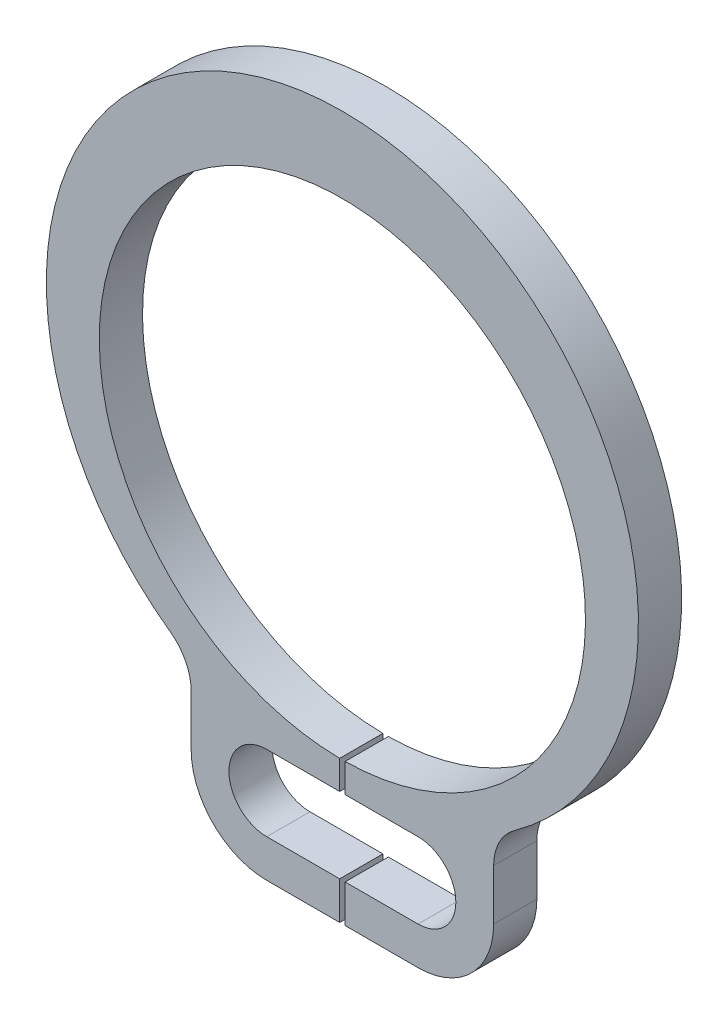
ISO-10303-21;
HEADER;
FILE_DESCRIPTION(('STEP AP214'),'2;1');
FILE_NAME('part.step','',(''),(''),'','','');
FILE_SCHEMA(('AUTOMOTIVE_DESIGN { 1 0 10303 214 1 1 1 1 }'));
ENDSEC;
DATA;
#1=APPLICATION_CONTEXT('core data for automotive mechanical design processes');
#2=APPLICATION_PROTOCOL_DEFINITION('international standard','automotive_design',2000,#1);
#3=PRODUCT_CONTEXT('',#1,'mechanical');
#4=PRODUCT('Part','Part','',(#3));
#5=PRODUCT_RELATED_PRODUCT_CATEGORY('part','',(#4));
#6=PRODUCT_DEFINITION_FORMATION('','',#4);
#7=PRODUCT_DEFINITION_CONTEXT('part definition',#1,'design');
#8=PRODUCT_DEFINITION('design','',#6,#7);
#9=PRODUCT_DEFINITION_SHAPE('','',#8);
#10=(LENGTH_UNIT() NAMED_UNIT(*) SI_UNIT(.MILLI.,.METRE.));
#11=(NAMED_UNIT(*) PLANE_ANGLE_UNIT() SI_UNIT($,.RADIAN.));
#12=(NAMED_UNIT(*) SI_UNIT($,.STERADIAN.) SOLID_ANGLE_UNIT());
#13=UNCERTAINTY_MEASURE_WITH_UNIT(LENGTH_MEASURE(1.E-05),#10,'distance_accuracy_value','');
#14=(GEOMETRIC_REPRESENTATION_CONTEXT(3) GLOBAL_UNCERTAINTY_ASSIGNED_CONTEXT((#13)) GLOBAL_UNIT_ASSIGNED_CONTEXT((#10,
#11,#12)) REPRESENTATION_CONTEXT('',''));
#15=CARTESIAN_POINT('',(0.,0.,0.));
#16=DIRECTION('',(0.,0.,1.));
#17=DIRECTION('',(1.,0.,0.));
#18=AXIS2_PLACEMENT_3D('',#15,#16,#17);
#19=CARTESIAN_POINT('',(0.7,-2.86574597618142,0.4));
#20=DIRECTION('',(0.,0.,-1.));
#21=DIRECTION('',(-1.,0.,0.));
#22=AXIS2_PLACEMENT_3D('',#19,#20,#21);
#23=CYLINDRICAL_SURFACE('',#22,0.35);
#24=CARTESIAN_POINT('',(0.7,-2.86574597618142,0.4));
#25=DIRECTION('',(0.,0.,1.));
#26=DIRECTION('',(-1.,0.,0.));
#27=AXIS2_PLACEMENT_3D('',#24,#25,#26);
#28=CIRCLE('',#27,0.35);
#29=CARTESIAN_POINT('',(0.7,-3.21574597618142,0.4));
#30=VERTEX_POINT('',#29);
#31=CARTESIAN_POINT('',(0.7,-2.51574597618142,0.4));
#32=VERTEX_POINT('',#31);
#33=EDGE_CURVE('E195',#30,#32,#28,.T.);
#34=ORIENTED_EDGE('',*,*,#33,.T.);
#35=DIRECTION('',(0.,0.,1.));
#36=VECTOR('',#35,1.);
#37=CARTESIAN_POINT('',(0.7,-2.51574597618142,0.));
#38=LINE('',#37,#36);
#39=CARTESIAN_POINT('',(0.7,-2.51574597618142,0.));
#40=VERTEX_POINT('',#39);
#41=EDGE_CURVE('E312',#40,#32,#38,.T.);
#42=ORIENTED_EDGE('',*,*,#41,.F.);
#43=CARTESIAN_POINT('',(0.7,-2.86574597618142,0.));
#44=DIRECTION('',(0.,0.,1.));
#45=DIRECTION('',(-1.,0.,0.));
#46=AXIS2_PLACEMENT_3D('',#43,#44,#45);
#47=CIRCLE('',#46,0.35);
#48=CARTESIAN_POINT('',(0.7,-3.21574597618142,0.));
#49=VERTEX_POINT('',#48);
#50=EDGE_CURVE('E200',#49,#40,#47,.T.);
#51=ORIENTED_EDGE('',*,*,#50,.F.);
#52=DIRECTION('',(0.,0.,1.));
#53=VECTOR('',#52,1.);
#54=CARTESIAN_POINT('',(0.7,-3.21574597618142,0.));
#55=LINE('',#54,#53);
#56=EDGE_CURVE('E188',#49,#30,#55,.T.);
#57=ORIENTED_EDGE('',*,*,#56,.T.);
#58=EDGE_LOOP('',(#34,#42,#51,#57));
#59=FACE_BOUND('',#58,.T.);
#60=ADVANCED_FACE('F33',(#59),#23,.F.);
#61=CARTESIAN_POINT('',(0.025,-3.56574597618142,0.));
#62=DIRECTION('',(1.,0.,0.));
#63=DIRECTION('',(0.,1.,0.));
#64=AXIS2_PLACEMENT_3D('',#61,#62,#63);
#65=PLANE('',#64);
#66=DIRECTION('',(0.,1.,0.));
#67=VECTOR('',#66,1.);
#68=CARTESIAN_POINT('',(0.025,-3.56574597618142,0.));
#69=LINE('',#68,#67);
#70=CARTESIAN_POINT('',(0.025,-2.51574597618142,0.));
#71=VERTEX_POINT('',#70);
#72=CARTESIAN_POINT('',(0.025,-2.24986110682415,0.));
#73=VERTEX_POINT('',#72);
#74=EDGE_CURVE('E320',#71,#73,#69,.T.);
#75=ORIENTED_EDGE('',*,*,#74,.F.);
#76=DIRECTION('',(0.,0.,1.));
#77=VECTOR('',#76,1.);
#78=CARTESIAN_POINT('',(0.025,-2.51574597618142,0.));
#79=LINE('',#78,#77);
#80=CARTESIAN_POINT('',(0.025,-2.51574597618142,0.4));
#81=VERTEX_POINT('',#80);
#82=EDGE_CURVE('E288',#71,#81,#79,.T.);
#83=ORIENTED_EDGE('',*,*,#82,.T.);
#84=DIRECTION('',(0.,1.,0.));
#85=VECTOR('',#84,1.);
#86=CARTESIAN_POINT('',(0.025,-3.56574597618142,0.4));
#87=LINE('',#86,#85);
#88=CARTESIAN_POINT('',(0.025,-2.24986110682415,0.4));
#89=VERTEX_POINT('',#88);
#90=EDGE_CURVE('E291',#81,#89,#87,.T.);
#91=ORIENTED_EDGE('',*,*,#90,.T.);
#92=DIRECTION('',(0.,0.,-1.));
#93=VECTOR('',#92,1.);
#94=CARTESIAN_POINT('',(0.025,-2.24986110682415,0.4));
#95=LINE('',#94,#93);
#96=EDGE_CURVE('E255',#89,#73,#95,.T.);
#97=ORIENTED_EDGE('',*,*,#96,.T.);
#98=EDGE_LOOP('',(#75,#83,#91,#97));
#99=FACE_BOUND('',#98,.T.);
#100=ADVANCED_FACE('F382',(#99),#65,.F.);
#101=CARTESIAN_POINT('',(-0.025,-3.56574597618142,0.));
#102=DIRECTION('',(-1.,0.,0.));
#103=DIRECTION('',(0.,-1.,0.));
#104=AXIS2_PLACEMENT_3D('',#101,#102,#103);
#105=PLANE('',#104);
#106=DIRECTION('',(0.,-1.,0.));
#107=VECTOR('',#106,1.);
#108=CARTESIAN_POINT('',(-0.025,-3.56574597618142,0.4));
#109=LINE('',#108,#107);
#110=CARTESIAN_POINT('',(-0.025,-2.24986110682415,0.4));
#111=VERTEX_POINT('',#110);
#112=CARTESIAN_POINT('',(-0.025,-2.51574597618142,0.4));
#113=VERTEX_POINT('',#112);
#114=EDGE_CURVE('E287',#111,#113,#109,.T.);
#115=ORIENTED_EDGE('',*,*,#114,.T.);
#116=DIRECTION('',(0.,0.,-1.));
#117=VECTOR('',#116,1.);
#118=CARTESIAN_POINT('',(-0.025,-2.51574597618142,0.));
#119=LINE('',#118,#117);
#120=CARTESIAN_POINT('',(-0.025,-2.51574597618142,0.));
#121=VERTEX_POINT('',#120);
#122=EDGE_CURVE('E11',#113,#121,#119,.T.);
#123=ORIENTED_EDGE('',*,*,#122,.T.);
#124=DIRECTION('',(0.,-1.,0.));
#125=VECTOR('',#124,1.);
#126=CARTESIAN_POINT('',(-0.025,-3.56574597618142,0.));
#127=LINE('',#126,#125);
#128=CARTESIAN_POINT('',(-0.025,-2.24986110682415,0.));
#129=VERTEX_POINT('',#128);
#130=EDGE_CURVE('E319',#129,#121,#127,.T.);
#131=ORIENTED_EDGE('',*,*,#130,.F.);
#132=DIRECTION('',(0.,0.,-1.));
#133=VECTOR('',#132,1.);
#134=CARTESIAN_POINT('',(-0.025,-2.24986110682415,0.4));
#135=LINE('',#134,#133);
#136=EDGE_CURVE('E258',#129,#111,#135,.F.);
#137=ORIENTED_EDGE('',*,*,#136,.T.);
#138=EDGE_LOOP('',(#115,#123,#131,#137));
#139=FACE_BOUND('',#138,.T.);
#140=ADVANCED_FACE('F375',(#139),#105,.F.);
#141=CARTESIAN_POINT('',(-0.7,-3.56574597618142,0.4));
#142=DIRECTION('',(0.,1.,0.));
#143=DIRECTION('',(0.,0.,1.));
#144=AXIS2_PLACEMENT_3D('',#141,#142,#143);
#145=PLANE('',#144);
#146=DIRECTION('',(1.,0.,0.));
#147=VECTOR('',#146,1.);
#148=CARTESIAN_POINT('',(-0.7,-3.56574597618142,0.));
#149=LINE('',#148,#147);
#150=CARTESIAN_POINT('',(-0.7,-3.56574597618142,0.));
#151=VERTEX_POINT('',#150);
#152=CARTESIAN_POINT('',(-0.025,-3.56574597618142,0.));
#153=VERTEX_POINT('',#152);
#154=EDGE_CURVE('E232',#151,#153,#149,.T.);
#155=ORIENTED_EDGE('',*,*,#154,.T.);
#156=DIRECTION('',(0.,0.,1.));
#157=VECTOR('',#156,1.);
#158=CARTESIAN_POINT('',(-0.025,-3.56574597618142,0.));
#159=LINE('',#158,#157);
#160=CARTESIAN_POINT('',(-0.025,-3.56574597618142,0.4));
#161=VERTEX_POINT('',#160);
#162=EDGE_CURVE('E303',#153,#161,#159,.T.);
#163=ORIENTED_EDGE('',*,*,#162,.T.);
#164=DIRECTION('',(1.,0.,0.));
#165=VECTOR('',#164,1.);
#166=CARTESIAN_POINT('',(-0.7,-3.56574597618142,0.4));
#167=LINE('',#166,#165);
#168=CARTESIAN_POINT('',(-0.7,-3.56574597618142,0.4));
#169=VERTEX_POINT('',#168);
#170=EDGE_CURVE('E215',#169,#161,#167,.T.);
#171=ORIENTED_EDGE('',*,*,#170,.F.);
#172=DIRECTION('',(0.,0.,-1.));
#173=VECTOR('',#172,1.);
#174=CARTESIAN_POINT('',(-0.7,-3.56574597618142,0.4));
#175=LINE('',#174,#173);
#176=EDGE_CURVE('E252',#169,#151,#175,.T.);
#177=ORIENTED_EDGE('',*,*,#176,.T.);
#178=EDGE_LOOP('',(#155,#163,#171,#177));
#179=FACE_BOUND('',#178,.T.);
#180=ADVANCED_FACE('F323',(#179),#145,.F.);
#181=CARTESIAN_POINT('',(-0.7,-2.86574597618142,0.4));
#182=DIRECTION('',(0.,0.,1.));
#183=DIRECTION('',(1.,0.,0.));
#184=AXIS2_PLACEMENT_3D('',#181,#182,#183);
#185=PLANE('',#184);
#186=DIRECTION('',(-1.,0.,0.));
#187=VECTOR('',#186,1.);
#188=CARTESIAN_POINT('',(-0.7,-2.51574597618142,0.4));
#189=LINE('',#188,#187);
#190=EDGE_CURVE('E48',#32,#81,#189,.T.);
#191=ORIENTED_EDGE('',*,*,#190,.F.);
#192=ORIENTED_EDGE('',*,*,#33,.F.);
#193=DIRECTION('',(1.,0.,0.));
#194=VECTOR('',#193,1.);
#195=CARTESIAN_POINT('',(-0.7,-3.21574597618142,0.4));
#196=LINE('',#195,#194);
#197=CARTESIAN_POINT('',(0.025,-3.21574597618142,0.4));
#198=VERTEX_POINT('',#197);
#199=EDGE_CURVE('E365',#198,#30,#196,.T.);
#200=ORIENTED_EDGE('',*,*,#199,.F.);
#201=CARTESIAN_POINT('',(0.025,-3.56574597618142,0.4));
#202=VERTEX_POINT('',#201);
#203=EDGE_CURVE('E298',#202,#198,#87,.T.);
#204=ORIENTED_EDGE('',*,*,#203,.F.);
#205=CARTESIAN_POINT('',(0.700000000000001,-3.56574597618142,0.4));
#206=VERTEX_POINT('',#205);
#207=EDGE_CURVE('E213',#202,#206,#167,.T.);
#208=ORIENTED_EDGE('',*,*,#207,.T.);
#209=CARTESIAN_POINT('',(0.7,-2.86574597618142,0.4));
#210=DIRECTION('',(0.,0.,1.));
#211=DIRECTION('',(-1.,0.,0.));
#212=AXIS2_PLACEMENT_3D('',#209,#210,#211);
#213=CIRCLE('',#212,0.7);
#214=CARTESIAN_POINT('',(1.4,-2.86574597618142,0.4));
#215=VERTEX_POINT('',#214);
#216=EDGE_CURVE('E218',#206,#215,#213,.T.);
#217=ORIENTED_EDGE('',*,*,#216,.T.);
#218=DIRECTION('',(0.,1.,0.));
#219=VECTOR('',#218,1.);
#220=CARTESIAN_POINT('',(1.4,-2.86574597618142,0.4));
#221=LINE('',#220,#219);
#222=CARTESIAN_POINT('',(1.4,-2.39734858940393,0.4));
#223=VERTEX_POINT('',#222);
#224=EDGE_CURVE('E220',#215,#223,#221,.T.);
#225=ORIENTED_EDGE('',*,*,#224,.T.);
#226=CARTESIAN_POINT('',(1.86666666666667,-2.39734858940393,0.4));
#227=DIRECTION('',(0.,0.,1.));
#228=DIRECTION('',(1.,0.,0.));
#229=AXIS2_PLACEMENT_3D('',#226,#227,#228);
#230=CIRCLE('',#229,0.466666666666667);
#231=CARTESIAN_POINT('',(1.5950103950104,-2.01790076974016,0.4));
#232=VERTEX_POINT('',#231);
#233=EDGE_CURVE('E272',#223,#232,#230,.F.);
#234=ORIENTED_EDGE('',*,*,#233,.T.);
#235=CARTESIAN_POINT('',(0.,0.21,0.4));
#236=DIRECTION('',(0.,0.,1.));
#237=DIRECTION('',(1.,0.,0.));
#238=AXIS2_PLACEMENT_3D('',#235,#236,#237);
#239=CIRCLE('',#238,2.74);
#240=CARTESIAN_POINT('',(-1.59501039501039,-2.01790076974016,0.4));
#241=VERTEX_POINT('',#240);
#242=EDGE_CURVE('E223',#232,#241,#239,.T.);
#243=ORIENTED_EDGE('',*,*,#242,.T.);
#244=CARTESIAN_POINT('',(-1.86666666666667,-2.39734858940393,0.4));
#245=DIRECTION('',(0.,0.,1.));
#246=DIRECTION('',(1.,0.,0.));
#247=AXIS2_PLACEMENT_3D('',#244,#245,#246);
#248=CIRCLE('',#247,0.466666666666667);
#249=CARTESIAN_POINT('',(-1.4,-2.39734858940393,0.4));
#250=VERTEX_POINT('',#249);
#251=EDGE_CURVE('E276',#241,#250,#248,.F.);
#252=ORIENTED_EDGE('',*,*,#251,.T.);
#253=DIRECTION('',(0.,-1.,0.));
#254=VECTOR('',#253,1.);
#255=CARTESIAN_POINT('',(-1.4,-2.86574597618142,0.4));
#256=LINE('',#255,#254);
#257=CARTESIAN_POINT('',(-1.4,-2.86574597618142,0.4));
#258=VERTEX_POINT('',#257);
#259=EDGE_CURVE('E226',#250,#258,#256,.T.);
#260=ORIENTED_EDGE('',*,*,#259,.T.);
#261=CARTESIAN_POINT('',(-0.7,-2.86574597618142,0.4));
#262=DIRECTION('',(0.,0.,1.));
#263=DIRECTION('',(1.,0.,0.));
#264=AXIS2_PLACEMENT_3D('',#261,#262,#263);
#265=CIRCLE('',#264,0.7);
#266=EDGE_CURVE('E210',#258,#169,#265,.T.);
#267=ORIENTED_EDGE('',*,*,#266,.T.);
#268=ORIENTED_EDGE('',*,*,#170,.T.);
#269=CARTESIAN_POINT('',(-0.025,-3.21574597618142,0.4));
#270=VERTEX_POINT('',#269);
#271=EDGE_CURVE('E281',#270,#161,#109,.T.);
#272=ORIENTED_EDGE('',*,*,#271,.F.);
#273=CARTESIAN_POINT('',(-0.7,-3.21574597618142,0.4));
#274=VERTEX_POINT('',#273);
#275=EDGE_CURVE('E286',#274,#270,#196,.T.);
#276=ORIENTED_EDGE('',*,*,#275,.F.);
#277=CARTESIAN_POINT('',(-0.7,-2.86574597618142,0.4));
#278=DIRECTION('',(0.,0.,1.));
#279=DIRECTION('',(1.,0.,0.));
#280=AXIS2_PLACEMENT_3D('',#277,#278,#279);
#281=CIRCLE('',#280,0.35);
#282=CARTESIAN_POINT('',(-0.7,-2.51574597618142,0.4));
#283=VERTEX_POINT('',#282);
#284=EDGE_CURVE('E187',#283,#274,#281,.T.);
#285=ORIENTED_EDGE('',*,*,#284,.F.);
#286=EDGE_CURVE('E367',#113,#283,#189,.T.);
#287=ORIENTED_EDGE('',*,*,#286,.F.);
#288=ORIENTED_EDGE('',*,*,#114,.F.);
#289=CARTESIAN_POINT('',(0.,0.,0.4));
#290=DIRECTION('',(0.,0.,1.));
#291=DIRECTION('',(1.,0.,0.));
#292=AXIS2_PLACEMENT_3D('',#289,#290,#291);
#293=CIRCLE('',#292,2.25);
#294=EDGE_CURVE('E204',#89,#111,#293,.T.);
#295=ORIENTED_EDGE('',*,*,#294,.F.);
#296=ORIENTED_EDGE('',*,*,#90,.F.);
#297=EDGE_LOOP('',(#191,#192,#200,#204,#208,#217,#225,#234,#243,#252,#260,#267,#268,#272,#276,
#285,#287,#288,#295,#296));
#298=FACE_BOUND('',#297,.T.);
#299=ADVANCED_FACE('F285',(#298),#185,.T.);
#300=CARTESIAN_POINT('',(-0.7,-2.86574597618142,0.));
#301=DIRECTION('',(0.,0.,1.));
#302=DIRECTION('',(1.,0.,0.));
#303=AXIS2_PLACEMENT_3D('',#300,#301,#302);
#304=PLANE('',#303);
#305=ORIENTED_EDGE('',*,*,#50,.T.);
#306=DIRECTION('',(-1.,0.,0.));
#307=VECTOR('',#306,1.);
#308=CARTESIAN_POINT('',(-0.7,-2.51574597618142,0.));
#309=LINE('',#308,#307);
#310=EDGE_CURVE('E189',#40,#71,#309,.T.);
#311=ORIENTED_EDGE('',*,*,#310,.T.);
#312=ORIENTED_EDGE('',*,*,#74,.T.);
#313=CARTESIAN_POINT('',(0.,0.,0.));
#314=DIRECTION('',(0.,0.,1.));
#315=DIRECTION('',(1.,0.,0.));
#316=AXIS2_PLACEMENT_3D('',#313,#314,#315);
#317=CIRCLE('',#316,2.25);
#318=EDGE_CURVE('E197',#73,#129,#317,.T.);
#319=ORIENTED_EDGE('',*,*,#318,.T.);
#320=ORIENTED_EDGE('',*,*,#130,.T.);
#321=CARTESIAN_POINT('',(-0.7,-2.51574597618142,0.));
#322=VERTEX_POINT('',#321);
#323=EDGE_CURVE('E178',#121,#322,#309,.T.);
#324=ORIENTED_EDGE('',*,*,#323,.T.);
#325=CARTESIAN_POINT('',(-0.7,-2.86574597618142,0.));
#326=DIRECTION('',(0.,0.,1.));
#327=DIRECTION('',(1.,0.,0.));
#328=AXIS2_PLACEMENT_3D('',#325,#326,#327);
#329=CIRCLE('',#328,0.35);
#330=CARTESIAN_POINT('',(-0.7,-3.21574597618142,0.));
#331=VERTEX_POINT('',#330);
#332=EDGE_CURVE('E185',#322,#331,#329,.T.);
#333=ORIENTED_EDGE('',*,*,#332,.T.);
#334=DIRECTION('',(1.,0.,0.));
#335=VECTOR('',#334,1.);
#336=CARTESIAN_POINT('',(-0.7,-3.21574597618142,0.));
#337=LINE('',#336,#335);
#338=CARTESIAN_POINT('',(-0.025,-3.21574597618142,0.));
#339=VERTEX_POINT('',#338);
#340=EDGE_CURVE('E169',#331,#339,#337,.T.);
#341=ORIENTED_EDGE('',*,*,#340,.T.);
#342=EDGE_CURVE('E283',#339,#153,#127,.T.);
#343=ORIENTED_EDGE('',*,*,#342,.T.);
#344=ORIENTED_EDGE('',*,*,#154,.F.);
#345=CARTESIAN_POINT('',(-0.7,-2.86574597618142,0.));
#346=DIRECTION('',(0.,0.,1.));
#347=DIRECTION('',(1.,0.,0.));
#348=AXIS2_PLACEMENT_3D('',#345,#346,#347);
#349=CIRCLE('',#348,0.7);
#350=CARTESIAN_POINT('',(-1.4,-2.86574597618142,0.));
#351=VERTEX_POINT('',#350);
#352=EDGE_CURVE('E207',#351,#151,#349,.T.);
#353=ORIENTED_EDGE('',*,*,#352,.F.);
#354=DIRECTION('',(0.,-1.,0.));
#355=VECTOR('',#354,1.);
#356=CARTESIAN_POINT('',(-1.4,-2.86574597618142,0.));
#357=LINE('',#356,#355);
#358=CARTESIAN_POINT('',(-1.4,-2.39734858940393,0.));
#359=VERTEX_POINT('',#358);
#360=EDGE_CURVE('E214',#359,#351,#357,.T.);
#361=ORIENTED_EDGE('',*,*,#360,.F.);
#362=CARTESIAN_POINT('',(-1.86666666666667,-2.39734858940393,0.));
#363=DIRECTION('',(0.,0.,1.));
#364=DIRECTION('',(1.,0.,0.));
#365=AXIS2_PLACEMENT_3D('',#362,#363,#364);
#366=CIRCLE('',#365,0.466666666666667);
#367=CARTESIAN_POINT('',(-1.59501039501039,-2.01790076974016,0.));
#368=VERTEX_POINT('',#367);
#369=EDGE_CURVE('E274',#359,#368,#366,.T.);
#370=ORIENTED_EDGE('',*,*,#369,.T.);
#371=CARTESIAN_POINT('',(0.,0.21,0.));
#372=DIRECTION('',(0.,0.,1.));
#373=DIRECTION('',(1.,0.,0.));
#374=AXIS2_PLACEMENT_3D('',#371,#372,#373);
#375=CIRCLE('',#374,2.74);
#376=CARTESIAN_POINT('',(1.5950103950104,-2.01790076974016,0.));
#377=VERTEX_POINT('',#376);
#378=EDGE_CURVE('E240',#377,#368,#375,.T.);
#379=ORIENTED_EDGE('',*,*,#378,.F.);
#380=CARTESIAN_POINT('',(1.86666666666667,-2.39734858940393,0.));
#381=DIRECTION('',(0.,0.,1.));
#382=DIRECTION('',(1.,0.,0.));
#383=AXIS2_PLACEMENT_3D('',#380,#381,#382);
#384=CIRCLE('',#383,0.466666666666667);
#385=CARTESIAN_POINT('',(1.4,-2.39734858940393,0.));
#386=VERTEX_POINT('',#385);
#387=EDGE_CURVE('E270',#377,#386,#384,.T.);
#388=ORIENTED_EDGE('',*,*,#387,.T.);
#389=DIRECTION('',(0.,1.,0.));
#390=VECTOR('',#389,1.);
#391=CARTESIAN_POINT('',(1.4,-2.86574597618142,0.));
#392=LINE('',#391,#390);
#393=CARTESIAN_POINT('',(1.4,-2.86574597618142,0.));
#394=VERTEX_POINT('',#393);
#395=EDGE_CURVE('E237',#394,#386,#392,.T.);
#396=ORIENTED_EDGE('',*,*,#395,.F.);
#397=CARTESIAN_POINT('',(0.7,-2.86574597618142,0.));
#398=DIRECTION('',(0.,0.,1.));
#399=DIRECTION('',(-1.,0.,0.));
#400=AXIS2_PLACEMENT_3D('',#397,#398,#399);
#401=CIRCLE('',#400,0.7);
#402=CARTESIAN_POINT('',(0.700000000000001,-3.56574597618142,0.));
#403=VERTEX_POINT('',#402);
#404=EDGE_CURVE('E235',#403,#394,#401,.T.);
#405=ORIENTED_EDGE('',*,*,#404,.F.);
#406=CARTESIAN_POINT('',(0.025,-3.56574597618142,0.));
#407=VERTEX_POINT('',#406);
#408=EDGE_CURVE('E231',#407,#403,#149,.T.);
#409=ORIENTED_EDGE('',*,*,#408,.F.);
#410=CARTESIAN_POINT('',(0.025,-3.21574597618142,0.));
#411=VERTEX_POINT('',#410);
#412=EDGE_CURVE('E296',#407,#411,#69,.T.);
#413=ORIENTED_EDGE('',*,*,#412,.T.);
#414=EDGE_CURVE('E56',#411,#49,#337,.T.);
#415=ORIENTED_EDGE('',*,*,#414,.T.);
#416=EDGE_LOOP('',(#305,#311,#312,#319,#320,#324,#333,#341,#343,#344,#353,#361,#370,#379,#388,
#396,#405,#409,#413,#415));
#417=FACE_BOUND('',#416,.T.);
#418=ADVANCED_FACE('F193',(#417),#304,.F.);
#419=CARTESIAN_POINT('',(-0.7,-2.86574597618142,0.4));
#420=DIRECTION('',(0.,0.,-1.));
#421=DIRECTION('',(-1.,0.,0.));
#422=AXIS2_PLACEMENT_3D('',#419,#420,#421);
#423=CYLINDRICAL_SURFACE('',#422,0.7);
#424=ORIENTED_EDGE('',*,*,#352,.T.);
#425=ORIENTED_EDGE('',*,*,#176,.F.);
#426=ORIENTED_EDGE('',*,*,#266,.F.);
#427=DIRECTION('',(0.,0.,-1.));
#428=VECTOR('',#427,1.);
#429=CARTESIAN_POINT('',(-1.4,-2.86574597618142,0.4));
#430=LINE('',#429,#428);
#431=EDGE_CURVE('E228',#258,#351,#430,.T.);
#432=ORIENTED_EDGE('',*,*,#431,.T.);
#433=EDGE_LOOP('',(#424,#425,#426,#432));
#434=FACE_BOUND('',#433,.T.);
#435=ADVANCED_FACE('F327',(#434),#423,.T.);
#436=ORIENTED_EDGE('',*,*,#207,.F.);
#437=DIRECTION('',(0.,0.,1.));
#438=VECTOR('',#437,1.);
#439=CARTESIAN_POINT('',(0.025,-3.56574597618142,0.));
#440=LINE('',#439,#438);
#441=EDGE_CURVE('E301',#407,#202,#440,.T.);
#442=ORIENTED_EDGE('',*,*,#441,.F.);
#443=ORIENTED_EDGE('',*,*,#408,.T.);
#444=DIRECTION('',(0.,0.,-1.));
#445=VECTOR('',#444,1.);
#446=CARTESIAN_POINT('',(0.700000000000001,-3.56574597618142,0.4));
#447=LINE('',#446,#445);
#448=EDGE_CURVE('E249',#206,#403,#447,.T.);
#449=ORIENTED_EDGE('',*,*,#448,.F.);
#450=EDGE_LOOP('',(#436,#442,#443,#449));
#451=FACE_BOUND('',#450,.T.);
#452=ADVANCED_FACE('F360',(#451),#145,.F.);
#453=CARTESIAN_POINT('',(0.7,-2.86574597618142,0.4));
#454=DIRECTION('',(0.,0.,-1.));
#455=DIRECTION('',(-1.,0.,0.));
#456=AXIS2_PLACEMENT_3D('',#453,#454,#455);
#457=CYLINDRICAL_SURFACE('',#456,0.7);
#458=ORIENTED_EDGE('',*,*,#404,.T.);
#459=DIRECTION('',(0.,0.,-1.));
#460=VECTOR('',#459,1.);
#461=CARTESIAN_POINT('',(1.4,-2.86574597618142,0.4));
#462=LINE('',#461,#460);
#463=EDGE_CURVE('E246',#215,#394,#462,.T.);
#464=ORIENTED_EDGE('',*,*,#463,.F.);
#465=ORIENTED_EDGE('',*,*,#216,.F.);
#466=ORIENTED_EDGE('',*,*,#448,.T.);
#467=EDGE_LOOP('',(#458,#464,#465,#466));
#468=FACE_BOUND('',#467,.T.);
#469=ADVANCED_FACE('F354',(#468),#457,.T.);
#470=CARTESIAN_POINT('',(1.4,-2.86574597618142,0.4));
#471=DIRECTION('',(-1.,0.,0.));
#472=DIRECTION('',(0.,-1.,0.));
#473=AXIS2_PLACEMENT_3D('',#470,#471,#472);
#474=PLANE('',#473);
#475=ORIENTED_EDGE('',*,*,#395,.T.);
#476=DIRECTION('',(0.,0.,1.));
#477=VECTOR('',#476,1.);
#478=CARTESIAN_POINT('',(1.4,-2.39734858940393,0.4));
#479=LINE('',#478,#477);
#480=EDGE_CURVE('E265',#386,#223,#479,.T.);
#481=ORIENTED_EDGE('',*,*,#480,.T.);
#482=ORIENTED_EDGE('',*,*,#224,.F.);
#483=ORIENTED_EDGE('',*,*,#463,.T.);
#484=EDGE_LOOP('',(#475,#481,#482,#483));
#485=FACE_BOUND('',#484,.T.);
#486=ADVANCED_FACE('F350',(#485),#474,.F.);
#487=CARTESIAN_POINT('',(0.,0.21,0.4));
#488=DIRECTION('',(0.,0.,-1.));
#489=DIRECTION('',(-1.,0.,0.));
#490=AXIS2_PLACEMENT_3D('',#487,#488,#489);
#491=CYLINDRICAL_SURFACE('',#490,2.74);
#492=ORIENTED_EDGE('',*,*,#242,.F.);
#493=DIRECTION('',(0.,0.,-1.));
#494=VECTOR('',#493,1.);
#495=CARTESIAN_POINT('',(1.5950103950104,-2.01790076974016,0.4));
#496=LINE('',#495,#494);
#497=EDGE_CURVE('E262',#232,#377,#496,.T.);
#498=ORIENTED_EDGE('',*,*,#497,.T.);
#499=ORIENTED_EDGE('',*,*,#378,.T.);
#500=DIRECTION('',(0.,0.,-1.));
#501=VECTOR('',#500,1.);
#502=CARTESIAN_POINT('',(-1.59501039501039,-2.01790076974016,0.4));
#503=LINE('',#502,#501);
#504=EDGE_CURVE('E260',#368,#241,#503,.F.);
#505=ORIENTED_EDGE('',*,*,#504,.T.);
#506=EDGE_LOOP('',(#492,#498,#499,#505));
#507=FACE_BOUND('',#506,.T.);
#508=ADVANCED_FACE('F340',(#507),#491,.T.);
#509=CARTESIAN_POINT('',(-1.4,-2.86574597618142,0.4));
#510=DIRECTION('',(1.,0.,0.));
#511=DIRECTION('',(0.,1.,0.));
#512=AXIS2_PLACEMENT_3D('',#509,#510,#511);
#513=PLANE('',#512);
#514=ORIENTED_EDGE('',*,*,#259,.F.);
#515=DIRECTION('',(0.,0.,1.));
#516=VECTOR('',#515,1.);
#517=CARTESIAN_POINT('',(-1.4,-2.39734858940393,0.));
#518=LINE('',#517,#516);
#519=EDGE_CURVE('E267',#250,#359,#518,.F.);
#520=ORIENTED_EDGE('',*,*,#519,.T.);
#521=ORIENTED_EDGE('',*,*,#360,.T.);
#522=ORIENTED_EDGE('',*,*,#431,.F.);
#523=EDGE_LOOP('',(#514,#520,#521,#522));
#524=FACE_BOUND('',#523,.T.);
#525=ADVANCED_FACE('F333',(#524),#513,.F.);
#526=CARTESIAN_POINT('',(0.,0.,0.4));
#527=DIRECTION('',(0.,0.,-1.));
#528=DIRECTION('',(-1.,0.,0.));
#529=AXIS2_PLACEMENT_3D('',#526,#527,#528);
#530=CYLINDRICAL_SURFACE('',#529,2.25);
#531=ORIENTED_EDGE('',*,*,#136,.F.);
#532=ORIENTED_EDGE('',*,*,#318,.F.);
#533=ORIENTED_EDGE('',*,*,#96,.F.);
#534=ORIENTED_EDGE('',*,*,#294,.T.);
#535=EDGE_LOOP('',(#531,#532,#533,#534));
#536=FACE_BOUND('',#535,.T.);
#537=ADVANCED_FACE('F379',(#536),#530,.F.);
#538=CARTESIAN_POINT('',(-0.7,-2.86574597618142,0.4));
#539=DIRECTION('',(0.,0.,-1.));
#540=DIRECTION('',(-1.,0.,0.));
#541=AXIS2_PLACEMENT_3D('',#538,#539,#540);
#542=CYLINDRICAL_SURFACE('',#541,0.35);
#543=DIRECTION('',(0.,0.,1.));
#544=VECTOR('',#543,1.);
#545=CARTESIAN_POINT('',(-0.7,-2.51574597618142,0.));
#546=LINE('',#545,#544);
#547=EDGE_CURVE('E313',#322,#283,#546,.T.);
#548=ORIENTED_EDGE('',*,*,#547,.T.);
#549=ORIENTED_EDGE('',*,*,#284,.T.);
#550=DIRECTION('',(0.,0.,1.));
#551=VECTOR('',#550,1.);
#552=CARTESIAN_POINT('',(-0.7,-3.21574597618142,0.));
#553=LINE('',#552,#551);
#554=EDGE_CURVE('E172',#331,#274,#553,.T.);
#555=ORIENTED_EDGE('',*,*,#554,.F.);
#556=ORIENTED_EDGE('',*,*,#332,.F.);
#557=EDGE_LOOP('',(#548,#549,#555,#556));
#558=FACE_BOUND('',#557,.T.);
#559=ADVANCED_FACE('F184',(#558),#542,.F.);
#560=ORIENTED_EDGE('',*,*,#203,.T.);
#561=DIRECTION('',(0.,0.,-1.));
#562=VECTOR('',#561,1.);
#563=CARTESIAN_POINT('',(0.025,-3.21574597618142,0.));
#564=LINE('',#563,#562);
#565=EDGE_CURVE('E292',#198,#411,#564,.T.);
#566=ORIENTED_EDGE('',*,*,#565,.T.);
#567=ORIENTED_EDGE('',*,*,#412,.F.);
#568=ORIENTED_EDGE('',*,*,#441,.T.);
#569=EDGE_LOOP('',(#560,#566,#567,#568));
#570=FACE_BOUND('',#569,.T.);
#571=ADVANCED_FACE('F363',(#570),#65,.F.);
#572=ORIENTED_EDGE('',*,*,#342,.F.);
#573=DIRECTION('',(0.,0.,1.));
#574=VECTOR('',#573,1.);
#575=CARTESIAN_POINT('',(-0.025,-3.21574597618142,0.));
#576=LINE('',#575,#574);
#577=EDGE_CURVE('E41',#339,#270,#576,.T.);
#578=ORIENTED_EDGE('',*,*,#577,.T.);
#579=ORIENTED_EDGE('',*,*,#271,.T.);
#580=ORIENTED_EDGE('',*,*,#162,.F.);
#581=EDGE_LOOP('',(#572,#578,#579,#580));
#582=FACE_BOUND('',#581,.T.);
#583=ADVANCED_FACE('F279',(#582),#105,.F.);
#584=CARTESIAN_POINT('',(1.86666666666667,-2.39734858940393,0.4));
#585=DIRECTION('',(0.,0.,-1.));
#586=DIRECTION('',(-1.,0.,0.));
#587=AXIS2_PLACEMENT_3D('',#584,#585,#586);
#588=CYLINDRICAL_SURFACE('',#587,0.466666666666667);
#589=ORIENTED_EDGE('',*,*,#233,.F.);
#590=ORIENTED_EDGE('',*,*,#480,.F.);
#591=ORIENTED_EDGE('',*,*,#387,.F.);
#592=ORIENTED_EDGE('',*,*,#497,.F.);
#593=EDGE_LOOP('',(#589,#590,#591,#592));
#594=FACE_BOUND('',#593,.T.);
#595=ADVANCED_FACE('F346',(#594),#588,.F.);
#596=CARTESIAN_POINT('',(-1.86666666666667,-2.39734858940393,0.4));
#597=DIRECTION('',(0.,0.,-1.));
#598=DIRECTION('',(-1.,0.,0.));
#599=AXIS2_PLACEMENT_3D('',#596,#597,#598);
#600=CYLINDRICAL_SURFACE('',#599,0.466666666666667);
#601=ORIENTED_EDGE('',*,*,#251,.F.);
#602=ORIENTED_EDGE('',*,*,#504,.F.);
#603=ORIENTED_EDGE('',*,*,#369,.F.);
#604=ORIENTED_EDGE('',*,*,#519,.F.);
#605=EDGE_LOOP('',(#601,#602,#603,#604));
#606=FACE_BOUND('',#605,.T.);
#607=ADVANCED_FACE('F35',(#606),#600,.F.);
#608=CARTESIAN_POINT('',(-0.7,-3.21574597618142,0.));
#609=DIRECTION('',(0.,-1.,0.));
#610=DIRECTION('',(0.,0.,-1.));
#611=AXIS2_PLACEMENT_3D('',#608,#609,#610);
#612=PLANE('',#611);
#613=ORIENTED_EDGE('',*,*,#340,.F.);
#614=ORIENTED_EDGE('',*,*,#554,.T.);
#615=ORIENTED_EDGE('',*,*,#275,.T.);
#616=ORIENTED_EDGE('',*,*,#577,.F.);
#617=EDGE_LOOP('',(#613,#614,#615,#616));
#618=FACE_BOUND('',#617,.T.);
#619=ADVANCED_FACE('F171',(#618),#612,.F.);
#620=CARTESIAN_POINT('',(-0.7,-2.51574597618142,0.));
#621=DIRECTION('',(0.,1.,0.));
#622=DIRECTION('',(0.,0.,1.));
#623=AXIS2_PLACEMENT_3D('',#620,#621,#622);
#624=PLANE('',#623);
#625=ORIENTED_EDGE('',*,*,#286,.T.);
#626=ORIENTED_EDGE('',*,*,#547,.F.);
#627=ORIENTED_EDGE('',*,*,#323,.F.);
#628=ORIENTED_EDGE('',*,*,#122,.F.);
#629=EDGE_LOOP('',(#625,#626,#627,#628));
#630=FACE_BOUND('',#629,.T.);
#631=ADVANCED_FACE('F371',(#630),#624,.F.);
#632=ORIENTED_EDGE('',*,*,#199,.T.);
#633=ORIENTED_EDGE('',*,*,#56,.F.);
#634=ORIENTED_EDGE('',*,*,#414,.F.);
#635=ORIENTED_EDGE('',*,*,#565,.F.);
#636=EDGE_LOOP('',(#632,#633,#634,#635));
#637=FACE_BOUND('',#636,.T.);
#638=ADVANCED_FACE('F386',(#637),#612,.F.);
#639=ORIENTED_EDGE('',*,*,#310,.F.);
#640=ORIENTED_EDGE('',*,*,#41,.T.);
#641=ORIENTED_EDGE('',*,*,#190,.T.);
#642=ORIENTED_EDGE('',*,*,#82,.F.);
#643=EDGE_LOOP('',(#639,#640,#641,#642));
#644=FACE_BOUND('',#643,.T.);
#645=ADVANCED_FACE('F384',(#644),#624,.F.);
#646=CLOSED_SHELL('',(#60,#100,#140,#180,#299,#418,#435,#452,#469,#486,#508,#525,#537,#559,#571,
#583,#595,#607,#619,#631,#638,#645));
#647=MANIFOLD_SOLID_BREP('B2',#646);
#648=ADVANCED_BREP_SHAPE_REPRESENTATION('',(#18,#647),#14);
#649=SHAPE_DEFINITION_REPRESENTATION(#9,#648);
ENDSEC;
END-ISO-10303-21;
